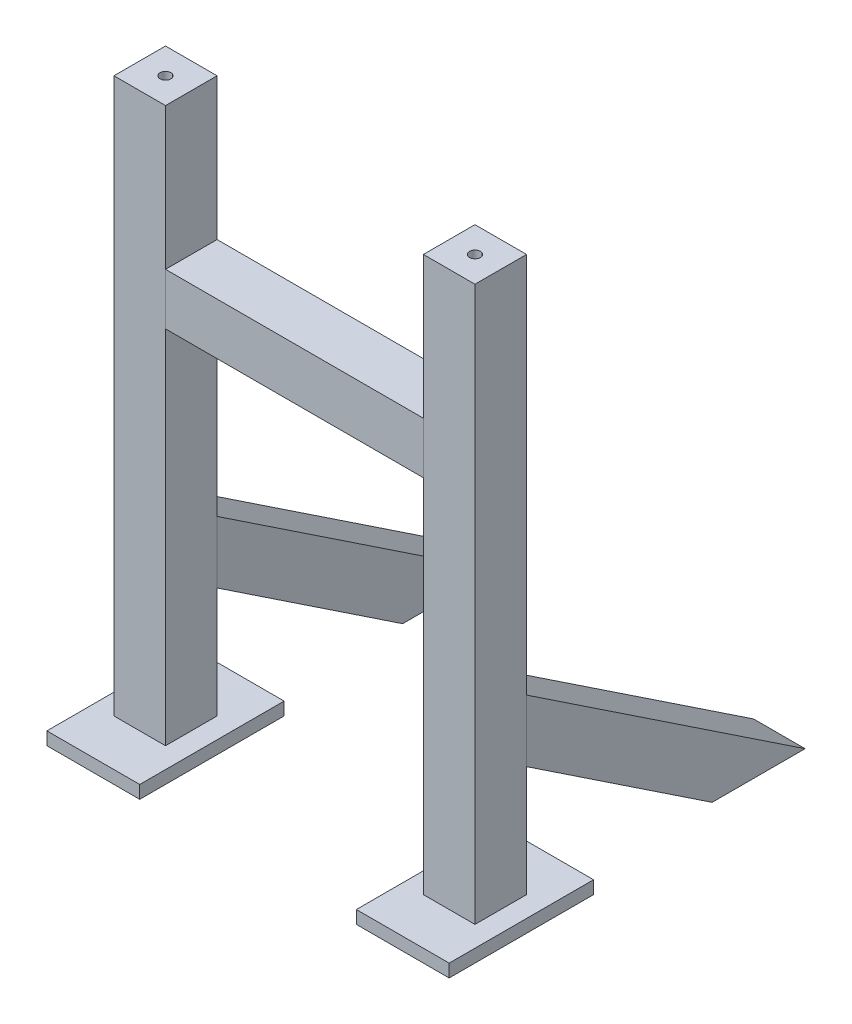
ISO-10303-21;
HEADER;
FILE_DESCRIPTION(('STEP AP214'),'2;1');
FILE_NAME('part.step','',(''),(''),'','','');
FILE_SCHEMA(('AUTOMOTIVE_DESIGN { 1 0 10303 214 1 1 1 1 }'));
ENDSEC;
DATA;
#1=APPLICATION_CONTEXT('core data for automotive mechanical design processes');
#2=APPLICATION_PROTOCOL_DEFINITION('international standard','automotive_design',2000,#1);
#3=PRODUCT_CONTEXT('',#1,'mechanical');
#4=PRODUCT('Part','Part','',(#3));
#5=PRODUCT_RELATED_PRODUCT_CATEGORY('part','',(#4));
#6=PRODUCT_DEFINITION_FORMATION('','',#4);
#7=PRODUCT_DEFINITION_CONTEXT('part definition',#1,'design');
#8=PRODUCT_DEFINITION('design','',#6,#7);
#9=PRODUCT_DEFINITION_SHAPE('','',#8);
#10=(LENGTH_UNIT() NAMED_UNIT(*) SI_UNIT(.MILLI.,.METRE.));
#11=(NAMED_UNIT(*) PLANE_ANGLE_UNIT() SI_UNIT($,.RADIAN.));
#12=(NAMED_UNIT(*) SI_UNIT($,.STERADIAN.) SOLID_ANGLE_UNIT());
#13=UNCERTAINTY_MEASURE_WITH_UNIT(LENGTH_MEASURE(1.E-05),#10,'distance_accuracy_value','');
#14=(GEOMETRIC_REPRESENTATION_CONTEXT(3) GLOBAL_UNCERTAINTY_ASSIGNED_CONTEXT((#13)) GLOBAL_UNIT_ASSIGNED_CONTEXT((#10,
#11,#12)) REPRESENTATION_CONTEXT('',''));
#15=CARTESIAN_POINT('',(0.,0.,0.));
#16=DIRECTION('',(0.,0.,1.));
#17=DIRECTION('',(1.,0.,0.));
#18=AXIS2_PLACEMENT_3D('',#15,#16,#17);
#19=CARTESIAN_POINT('',(-50.,72.0185042515466,-9.99999999999999));
#20=DIRECTION('',(0.,-0.832050294337844,0.554700196225229));
#21=DIRECTION('',(0.,-0.554700196225229,-0.832050294337844));
#22=AXIS2_PLACEMENT_3D('',#19,#20,#21);
#23=PLANE('',#22);
#24=DIRECTION('',(0.,0.554700196225229,0.832050294337844));
#25=VECTOR('',#24,1.);
#26=CARTESIAN_POINT('',(-70.,72.0185042515466,-9.99999999999999));
#27=LINE('',#26,#25);
#28=CARTESIAN_POINT('',(-70.,0.,-118.02775637732));
#29=VERTEX_POINT('',#28);
#30=CARTESIAN_POINT('',(-70.,72.0185042515466,-9.99999999999999));
#31=VERTEX_POINT('',#30);
#32=EDGE_CURVE('E114',#29,#31,#27,.T.);
#33=ORIENTED_EDGE('',*,*,#32,.T.);
#34=DIRECTION('',(-1.,0.,0.));
#35=VECTOR('',#34,1.);
#36=CARTESIAN_POINT('',(-50.,72.0185042515466,-9.99999999999999));
#37=LINE('',#36,#35);
#38=CARTESIAN_POINT('',(-50.,72.0185042515466,-9.99999999999999));
#39=VERTEX_POINT('',#38);
#40=EDGE_CURVE('E12',#39,#31,#37,.T.);
#41=ORIENTED_EDGE('',*,*,#40,.F.);
#42=DIRECTION('',(0.,0.554700196225229,0.832050294337844));
#43=VECTOR('',#42,1.);
#44=CARTESIAN_POINT('',(-50.,72.0185042515466,-9.99999999999999));
#45=LINE('',#44,#43);
#46=CARTESIAN_POINT('',(-50.,0.,-118.02775637732));
#47=VERTEX_POINT('',#46);
#48=EDGE_CURVE('E101',#47,#39,#45,.T.);
#49=ORIENTED_EDGE('',*,*,#48,.F.);
#50=DIRECTION('',(-1.,0.,0.));
#51=VECTOR('',#50,1.);
#52=CARTESIAN_POINT('',(-50.,0.,-118.02775637732));
#53=LINE('',#52,#51);
#54=EDGE_CURVE('E111',#47,#29,#53,.T.);
#55=ORIENTED_EDGE('',*,*,#54,.T.);
#56=EDGE_LOOP('',(#33,#41,#49,#55));
#57=FACE_BOUND('',#56,.T.);
#58=ADVANCED_FACE('F55',(#57),#23,.F.);
#59=CARTESIAN_POINT('',(-50.,47.9814957484534,-10.));
#60=DIRECTION('',(0.,0.,-1.));
#61=DIRECTION('',(-1.,0.,0.));
#62=AXIS2_PLACEMENT_3D('',#59,#60,#61);
#63=PLANE('',#62);
#64=DIRECTION('',(0.,-1.,0.));
#65=VECTOR('',#64,1.);
#66=CARTESIAN_POINT('',(-70.,47.9814957484534,-10.));
#67=LINE('',#66,#65);
#68=CARTESIAN_POINT('',(-70.,47.9814957484534,-10.));
#69=VERTEX_POINT('',#68);
#70=EDGE_CURVE('E110',#31,#69,#67,.T.);
#71=ORIENTED_EDGE('',*,*,#70,.T.);
#72=DIRECTION('',(-1.,0.,0.));
#73=VECTOR('',#72,1.);
#74=CARTESIAN_POINT('',(-50.,47.9814957484534,-10.));
#75=LINE('',#74,#73);
#76=CARTESIAN_POINT('',(-50.,47.9814957484534,-10.));
#77=VERTEX_POINT('',#76);
#78=EDGE_CURVE('E58',#77,#69,#75,.T.);
#79=ORIENTED_EDGE('',*,*,#78,.F.);
#80=DIRECTION('',(0.,-1.,0.));
#81=VECTOR('',#80,1.);
#82=CARTESIAN_POINT('',(-50.,47.9814957484534,-10.));
#83=LINE('',#82,#81);
#84=EDGE_CURVE('E96',#39,#77,#83,.T.);
#85=ORIENTED_EDGE('',*,*,#84,.F.);
#86=ORIENTED_EDGE('',*,*,#40,.T.);
#87=EDGE_LOOP('',(#71,#79,#85,#86));
#88=FACE_BOUND('',#87,.T.);
#89=ADVANCED_FACE('F106',(#88),#63,.F.);
#90=CARTESIAN_POINT('',(-50.,0.,-81.9722436226801));
#91=DIRECTION('',(0.,0.832050294337844,-0.554700196225229));
#92=DIRECTION('',(0.,0.554700196225229,0.832050294337844));
#93=AXIS2_PLACEMENT_3D('',#90,#91,#92);
#94=PLANE('',#93);
#95=DIRECTION('',(0.,-0.554700196225229,-0.832050294337844));
#96=VECTOR('',#95,1.);
#97=CARTESIAN_POINT('',(-70.,0.,-81.9722436226801));
#98=LINE('',#97,#96);
#99=CARTESIAN_POINT('',(-70.,0.,-81.9722436226801));
#100=VERTEX_POINT('',#99);
#101=EDGE_CURVE('E83',#69,#100,#98,.T.);
#102=ORIENTED_EDGE('',*,*,#101,.T.);
#103=DIRECTION('',(-1.,0.,0.));
#104=VECTOR('',#103,1.);
#105=CARTESIAN_POINT('',(-50.,0.,-81.9722436226801));
#106=LINE('',#105,#104);
#107=CARTESIAN_POINT('',(-50.,0.,-81.9722436226801));
#108=VERTEX_POINT('',#107);
#109=EDGE_CURVE('E108',#108,#100,#106,.T.);
#110=ORIENTED_EDGE('',*,*,#109,.F.);
#111=DIRECTION('',(0.,-0.554700196225229,-0.832050294337844));
#112=VECTOR('',#111,1.);
#113=CARTESIAN_POINT('',(-50.,0.,-81.9722436226801));
#114=LINE('',#113,#112);
#115=EDGE_CURVE('E103',#77,#108,#114,.T.);
#116=ORIENTED_EDGE('',*,*,#115,.F.);
#117=ORIENTED_EDGE('',*,*,#78,.T.);
#118=EDGE_LOOP('',(#102,#110,#116,#117));
#119=FACE_BOUND('',#118,.T.);
#120=ADVANCED_FACE('F107',(#119),#94,.F.);
#121=CARTESIAN_POINT('',(-50.,0.,-118.02775637732));
#122=DIRECTION('',(0.,1.,0.));
#123=DIRECTION('',(0.,0.,1.));
#124=AXIS2_PLACEMENT_3D('',#121,#122,#123);
#125=PLANE('',#124);
#126=DIRECTION('',(0.,0.,-1.));
#127=VECTOR('',#126,1.);
#128=CARTESIAN_POINT('',(-70.,0.,-118.02775637732));
#129=LINE('',#128,#127);
#130=EDGE_CURVE('E92',#100,#29,#129,.T.);
#131=ORIENTED_EDGE('',*,*,#130,.T.);
#132=ORIENTED_EDGE('',*,*,#54,.F.);
#133=DIRECTION('',(0.,0.,-1.));
#134=VECTOR('',#133,1.);
#135=CARTESIAN_POINT('',(-50.,0.,-118.02775637732));
#136=LINE('',#135,#134);
#137=EDGE_CURVE('E69',#108,#47,#136,.T.);
#138=ORIENTED_EDGE('',*,*,#137,.F.);
#139=ORIENTED_EDGE('',*,*,#109,.T.);
#140=EDGE_LOOP('',(#131,#132,#138,#139));
#141=FACE_BOUND('',#140,.T.);
#142=ADVANCED_FACE('F125',(#141),#125,.F.);
#143=CARTESIAN_POINT('',(-50.,0.,0.));
#144=DIRECTION('',(1.,0.,0.));
#145=DIRECTION('',(0.,0.,-1.));
#146=AXIS2_PLACEMENT_3D('',#143,#144,#145);
#147=PLANE('',#146);
#148=ORIENTED_EDGE('',*,*,#48,.T.);
#149=ORIENTED_EDGE('',*,*,#84,.T.);
#150=ORIENTED_EDGE('',*,*,#115,.T.);
#151=ORIENTED_EDGE('',*,*,#137,.T.);
#152=EDGE_LOOP('',(#148,#149,#150,#151));
#153=FACE_BOUND('',#152,.T.);
#154=ADVANCED_FACE('F100',(#153),#147,.T.);
#155=CARTESIAN_POINT('',(-70.,0.,0.));
#156=DIRECTION('',(1.,0.,0.));
#157=DIRECTION('',(0.,0.,-1.));
#158=AXIS2_PLACEMENT_3D('',#155,#156,#157);
#159=PLANE('',#158);
#160=ORIENTED_EDGE('',*,*,#32,.F.);
#161=ORIENTED_EDGE('',*,*,#130,.F.);
#162=ORIENTED_EDGE('',*,*,#101,.F.);
#163=ORIENTED_EDGE('',*,*,#70,.F.);
#164=EDGE_LOOP('',(#160,#161,#162,#163));
#165=FACE_BOUND('',#164,.T.);
#166=ADVANCED_FACE('F123',(#165),#159,.F.);
#167=CLOSED_SHELL('',(#58,#89,#120,#142,#154,#166));
#168=MANIFOLD_SOLID_BREP('B2',#167);
#169=CARTESIAN_POINT('',(70.,72.0185042515466,-9.99999999999999));
#170=DIRECTION('',(0.,-0.832050294337844,0.554700196225229));
#171=DIRECTION('',(0.,-0.554700196225229,-0.832050294337844));
#172=AXIS2_PLACEMENT_3D('',#169,#170,#171);
#173=PLANE('',#172);
#174=DIRECTION('',(0.,0.554700196225229,0.832050294337844));
#175=VECTOR('',#174,1.);
#176=CARTESIAN_POINT('',(50.,72.0185042515466,-9.99999999999999));
#177=LINE('',#176,#175);
#178=CARTESIAN_POINT('',(50.,0.,-118.02775637732));
#179=VERTEX_POINT('',#178);
#180=CARTESIAN_POINT('',(50.,72.0185042515466,-9.99999999999999));
#181=VERTEX_POINT('',#180);
#182=EDGE_CURVE('E240',#179,#181,#177,.T.);
#183=ORIENTED_EDGE('',*,*,#182,.T.);
#184=DIRECTION('',(-1.,0.,0.));
#185=VECTOR('',#184,1.);
#186=CARTESIAN_POINT('',(70.,72.0185042515466,-9.99999999999999));
#187=LINE('',#186,#185);
#188=CARTESIAN_POINT('',(70.,72.0185042515466,-9.99999999999999));
#189=VERTEX_POINT('',#188);
#190=EDGE_CURVE('E49',#189,#181,#187,.T.);
#191=ORIENTED_EDGE('',*,*,#190,.F.);
#192=DIRECTION('',(0.,0.554700196225229,0.832050294337844));
#193=VECTOR('',#192,1.);
#194=CARTESIAN_POINT('',(70.,72.0185042515466,-9.99999999999999));
#195=LINE('',#194,#193);
#196=CARTESIAN_POINT('',(70.,0.,-118.02775637732));
#197=VERTEX_POINT('',#196);
#198=EDGE_CURVE('E223',#197,#189,#195,.T.);
#199=ORIENTED_EDGE('',*,*,#198,.F.);
#200=DIRECTION('',(-1.,0.,0.));
#201=VECTOR('',#200,1.);
#202=CARTESIAN_POINT('',(70.,0.,-118.02775637732));
#203=LINE('',#202,#201);
#204=EDGE_CURVE('E231',#197,#179,#203,.T.);
#205=ORIENTED_EDGE('',*,*,#204,.T.);
#206=EDGE_LOOP('',(#183,#191,#199,#205));
#207=FACE_BOUND('',#206,.T.);
#208=ADVANCED_FACE('F172',(#207),#173,.F.);
#209=CARTESIAN_POINT('',(70.,47.9814957484534,-10.));
#210=DIRECTION('',(0.,0.,-1.));
#211=DIRECTION('',(-1.,0.,0.));
#212=AXIS2_PLACEMENT_3D('',#209,#210,#211);
#213=PLANE('',#212);
#214=DIRECTION('',(0.,-1.,0.));
#215=VECTOR('',#214,1.);
#216=CARTESIAN_POINT('',(50.,47.9814957484534,-10.));
#217=LINE('',#216,#215);
#218=CARTESIAN_POINT('',(50.,47.9814957484534,-10.));
#219=VERTEX_POINT('',#218);
#220=EDGE_CURVE('E230',#181,#219,#217,.T.);
#221=ORIENTED_EDGE('',*,*,#220,.T.);
#222=DIRECTION('',(-1.,0.,0.));
#223=VECTOR('',#222,1.);
#224=CARTESIAN_POINT('',(70.,47.9814957484534,-10.));
#225=LINE('',#224,#223);
#226=CARTESIAN_POINT('',(70.,47.9814957484534,-10.));
#227=VERTEX_POINT('',#226);
#228=EDGE_CURVE('E185',#227,#219,#225,.T.);
#229=ORIENTED_EDGE('',*,*,#228,.F.);
#230=DIRECTION('',(0.,-1.,0.));
#231=VECTOR('',#230,1.);
#232=CARTESIAN_POINT('',(70.,47.9814957484534,-10.));
#233=LINE('',#232,#231);
#234=EDGE_CURVE('E220',#189,#227,#233,.T.);
#235=ORIENTED_EDGE('',*,*,#234,.F.);
#236=ORIENTED_EDGE('',*,*,#190,.T.);
#237=EDGE_LOOP('',(#221,#229,#235,#236));
#238=FACE_BOUND('',#237,.T.);
#239=ADVANCED_FACE('F226',(#238),#213,.F.);
#240=CARTESIAN_POINT('',(70.,0.,-81.9722436226801));
#241=DIRECTION('',(0.,0.832050294337844,-0.554700196225229));
#242=DIRECTION('',(0.,0.554700196225229,0.832050294337844));
#243=AXIS2_PLACEMENT_3D('',#240,#241,#242);
#244=PLANE('',#243);
#245=DIRECTION('',(0.,-0.554700196225229,-0.832050294337844));
#246=VECTOR('',#245,1.);
#247=CARTESIAN_POINT('',(50.,0.,-81.9722436226801));
#248=LINE('',#247,#246);
#249=CARTESIAN_POINT('',(50.,0.,-81.9722436226801));
#250=VERTEX_POINT('',#249);
#251=EDGE_CURVE('E210',#219,#250,#248,.T.);
#252=ORIENTED_EDGE('',*,*,#251,.T.);
#253=DIRECTION('',(-1.,0.,0.));
#254=VECTOR('',#253,1.);
#255=CARTESIAN_POINT('',(70.,0.,-81.9722436226801));
#256=LINE('',#255,#254);
#257=CARTESIAN_POINT('',(70.,0.,-81.9722436226801));
#258=VERTEX_POINT('',#257);
#259=EDGE_CURVE('E229',#258,#250,#256,.T.);
#260=ORIENTED_EDGE('',*,*,#259,.F.);
#261=DIRECTION('',(0.,-0.554700196225229,-0.832050294337844));
#262=VECTOR('',#261,1.);
#263=CARTESIAN_POINT('',(70.,0.,-81.9722436226801));
#264=LINE('',#263,#262);
#265=EDGE_CURVE('E224',#227,#258,#264,.T.);
#266=ORIENTED_EDGE('',*,*,#265,.F.);
#267=ORIENTED_EDGE('',*,*,#228,.T.);
#268=EDGE_LOOP('',(#252,#260,#266,#267));
#269=FACE_BOUND('',#268,.T.);
#270=ADVANCED_FACE('F233',(#269),#244,.F.);
#271=CARTESIAN_POINT('',(70.,0.,-118.02775637732));
#272=DIRECTION('',(0.,1.,0.));
#273=DIRECTION('',(0.,0.,1.));
#274=AXIS2_PLACEMENT_3D('',#271,#272,#273);
#275=PLANE('',#274);
#276=DIRECTION('',(0.,0.,-1.));
#277=VECTOR('',#276,1.);
#278=CARTESIAN_POINT('',(50.,0.,-118.02775637732));
#279=LINE('',#278,#277);
#280=EDGE_CURVE('E214',#250,#179,#279,.T.);
#281=ORIENTED_EDGE('',*,*,#280,.T.);
#282=ORIENTED_EDGE('',*,*,#204,.F.);
#283=DIRECTION('',(0.,0.,-1.));
#284=VECTOR('',#283,1.);
#285=CARTESIAN_POINT('',(70.,0.,-118.02775637732));
#286=LINE('',#285,#284);
#287=EDGE_CURVE('E188',#258,#197,#286,.T.);
#288=ORIENTED_EDGE('',*,*,#287,.F.);
#289=ORIENTED_EDGE('',*,*,#259,.T.);
#290=EDGE_LOOP('',(#281,#282,#288,#289));
#291=FACE_BOUND('',#290,.T.);
#292=ADVANCED_FACE('F242',(#291),#275,.F.);
#293=CARTESIAN_POINT('',(70.,0.,0.));
#294=DIRECTION('',(1.,0.,0.));
#295=DIRECTION('',(0.,0.,-1.));
#296=AXIS2_PLACEMENT_3D('',#293,#294,#295);
#297=PLANE('',#296);
#298=ORIENTED_EDGE('',*,*,#198,.T.);
#299=ORIENTED_EDGE('',*,*,#234,.T.);
#300=ORIENTED_EDGE('',*,*,#265,.T.);
#301=ORIENTED_EDGE('',*,*,#287,.T.);
#302=EDGE_LOOP('',(#298,#299,#300,#301));
#303=FACE_BOUND('',#302,.T.);
#304=ADVANCED_FACE('F222',(#303),#297,.T.);
#305=CARTESIAN_POINT('',(50.,0.,0.));
#306=DIRECTION('',(1.,0.,0.));
#307=DIRECTION('',(0.,0.,-1.));
#308=AXIS2_PLACEMENT_3D('',#305,#306,#307);
#309=PLANE('',#308);
#310=ORIENTED_EDGE('',*,*,#182,.F.);
#311=ORIENTED_EDGE('',*,*,#280,.F.);
#312=ORIENTED_EDGE('',*,*,#251,.F.);
#313=ORIENTED_EDGE('',*,*,#220,.F.);
#314=EDGE_LOOP('',(#310,#311,#312,#313));
#315=FACE_BOUND('',#314,.T.);
#316=ADVANCED_FACE('F250',(#315),#309,.F.);
#317=CLOSED_SHELL('',(#208,#239,#270,#292,#304,#316));
#318=MANIFOLD_SOLID_BREP('B6',#317);
#319=CARTESIAN_POINT('',(50.,0.,0.));
#320=DIRECTION('',(1.,0.,0.));
#321=DIRECTION('',(0.,0.,-1.));
#322=AXIS2_PLACEMENT_3D('',#319,#320,#321);
#323=PLANE('',#322);
#324=DIRECTION('',(0.,1.,0.));
#325=VECTOR('',#324,1.);
#326=CARTESIAN_POINT('',(50.,145.,-10.));
#327=LINE('',#326,#325);
#328=CARTESIAN_POINT('',(50.,145.,-10.));
#329=VERTEX_POINT('',#328);
#330=CARTESIAN_POINT('',(50.,165.,-10.));
#331=VERTEX_POINT('',#330);
#332=EDGE_CURVE('E349',#329,#331,#327,.T.);
#333=ORIENTED_EDGE('',*,*,#332,.T.);
#334=DIRECTION('',(0.,0.,1.));
#335=VECTOR('',#334,1.);
#336=CARTESIAN_POINT('',(50.,165.,-10.));
#337=LINE('',#336,#335);
#338=CARTESIAN_POINT('',(50.,165.,10.));
#339=VERTEX_POINT('',#338);
#340=EDGE_CURVE('E344',#331,#339,#337,.T.);
#341=ORIENTED_EDGE('',*,*,#340,.T.);
#342=DIRECTION('',(0.,-1.,0.));
#343=VECTOR('',#342,1.);
#344=CARTESIAN_POINT('',(50.,145.,10.));
#345=LINE('',#344,#343);
#346=CARTESIAN_POINT('',(50.,145.,10.));
#347=VERTEX_POINT('',#346);
#348=EDGE_CURVE('E346',#339,#347,#345,.T.);
#349=ORIENTED_EDGE('',*,*,#348,.T.);
#350=DIRECTION('',(0.,0.,-1.));
#351=VECTOR('',#350,1.);
#352=CARTESIAN_POINT('',(50.,145.,-10.));
#353=LINE('',#352,#351);
#354=EDGE_CURVE('E312',#347,#329,#353,.T.);
#355=ORIENTED_EDGE('',*,*,#354,.T.);
#356=EDGE_LOOP('',(#333,#341,#349,#355));
#357=FACE_BOUND('',#356,.T.);
#358=CARTESIAN_POINT('',(50.,155.,0.));
#359=DIRECTION('',(1.,0.,0.));
#360=DIRECTION('',(0.,0.,-1.));
#361=AXIS2_PLACEMENT_3D('',#358,#359,#360);
#362=CIRCLE('',#361,2.1);
#363=CARTESIAN_POINT('',(50.,155.,-2.1));
#364=VERTEX_POINT('',#363);
#365=EDGE_CURVE('E361',#364,#364,#362,.T.);
#366=ORIENTED_EDGE('',*,*,#365,.F.);
#367=EDGE_LOOP('',(#366));
#368=FACE_BOUND('',#367,.T.);
#369=ADVANCED_FACE('F298',(#357,#368),#323,.T.);
#370=CARTESIAN_POINT('',(-50.,0.,0.));
#371=DIRECTION('',(1.,0.,0.));
#372=DIRECTION('',(0.,0.,-1.));
#373=AXIS2_PLACEMENT_3D('',#370,#371,#372);
#374=PLANE('',#373);
#375=DIRECTION('',(0.,1.,0.));
#376=VECTOR('',#375,1.);
#377=CARTESIAN_POINT('',(-50.,145.,-10.));
#378=LINE('',#377,#376);
#379=CARTESIAN_POINT('',(-50.,145.,-10.));
#380=VERTEX_POINT('',#379);
#381=CARTESIAN_POINT('',(-50.,165.,-10.));
#382=VERTEX_POINT('',#381);
#383=EDGE_CURVE('E359',#380,#382,#378,.T.);
#384=ORIENTED_EDGE('',*,*,#383,.F.);
#385=DIRECTION('',(0.,0.,-1.));
#386=VECTOR('',#385,1.);
#387=CARTESIAN_POINT('',(-50.,145.,-10.));
#388=LINE('',#387,#386);
#389=CARTESIAN_POINT('',(-50.,145.,10.));
#390=VERTEX_POINT('',#389);
#391=EDGE_CURVE('E337',#390,#380,#388,.T.);
#392=ORIENTED_EDGE('',*,*,#391,.F.);
#393=DIRECTION('',(0.,-1.,0.));
#394=VECTOR('',#393,1.);
#395=CARTESIAN_POINT('',(-50.,145.,10.));
#396=LINE('',#395,#394);
#397=CARTESIAN_POINT('',(-50.,165.,10.));
#398=VERTEX_POINT('',#397);
#399=EDGE_CURVE('E330',#398,#390,#396,.T.);
#400=ORIENTED_EDGE('',*,*,#399,.F.);
#401=DIRECTION('',(0.,0.,1.));
#402=VECTOR('',#401,1.);
#403=CARTESIAN_POINT('',(-50.,165.,-10.));
#404=LINE('',#403,#402);
#405=EDGE_CURVE('E355',#382,#398,#404,.T.);
#406=ORIENTED_EDGE('',*,*,#405,.F.);
#407=EDGE_LOOP('',(#384,#392,#400,#406));
#408=FACE_BOUND('',#407,.T.);
#409=CARTESIAN_POINT('',(-50.,155.,0.));
#410=DIRECTION('',(1.,0.,0.));
#411=DIRECTION('',(0.,0.,-1.));
#412=AXIS2_PLACEMENT_3D('',#409,#410,#411);
#413=CIRCLE('',#412,2.1);
#414=CARTESIAN_POINT('',(-50.,155.,-2.1));
#415=VERTEX_POINT('',#414);
#416=EDGE_CURVE('E374',#415,#415,#413,.T.);
#417=ORIENTED_EDGE('',*,*,#416,.T.);
#418=EDGE_LOOP('',(#417));
#419=FACE_BOUND('',#418,.T.);
#420=ADVANCED_FACE('F371',(#408,#419),#374,.F.);
#421=CARTESIAN_POINT('',(50.,145.,-10.));
#422=DIRECTION('',(0.,0.,1.));
#423=DIRECTION('',(1.,0.,0.));
#424=AXIS2_PLACEMENT_3D('',#421,#422,#423);
#425=PLANE('',#424);
#426=ORIENTED_EDGE('',*,*,#383,.T.);
#427=DIRECTION('',(-1.,0.,0.));
#428=VECTOR('',#427,1.);
#429=CARTESIAN_POINT('',(50.,165.,-10.));
#430=LINE('',#429,#428);
#431=EDGE_CURVE('E175',#331,#382,#430,.T.);
#432=ORIENTED_EDGE('',*,*,#431,.F.);
#433=ORIENTED_EDGE('',*,*,#332,.F.);
#434=DIRECTION('',(-1.,0.,0.));
#435=VECTOR('',#434,1.);
#436=CARTESIAN_POINT('',(50.,145.,-10.));
#437=LINE('',#436,#435);
#438=EDGE_CURVE('E358',#329,#380,#437,.T.);
#439=ORIENTED_EDGE('',*,*,#438,.T.);
#440=EDGE_LOOP('',(#426,#432,#433,#439));
#441=FACE_BOUND('',#440,.T.);
#442=ADVANCED_FACE('F296',(#441),#425,.F.);
#443=CARTESIAN_POINT('',(50.,165.,-10.));
#444=DIRECTION('',(0.,-1.,0.));
#445=DIRECTION('',(0.,0.,-1.));
#446=AXIS2_PLACEMENT_3D('',#443,#444,#445);
#447=PLANE('',#446);
#448=ORIENTED_EDGE('',*,*,#405,.T.);
#449=DIRECTION('',(-1.,0.,0.));
#450=VECTOR('',#449,1.);
#451=CARTESIAN_POINT('',(50.,165.,10.));
#452=LINE('',#451,#450);
#453=EDGE_CURVE('E304',#339,#398,#452,.T.);
#454=ORIENTED_EDGE('',*,*,#453,.F.);
#455=ORIENTED_EDGE('',*,*,#340,.F.);
#456=ORIENTED_EDGE('',*,*,#431,.T.);
#457=EDGE_LOOP('',(#448,#454,#455,#456));
#458=FACE_BOUND('',#457,.T.);
#459=ADVANCED_FACE('F352',(#458),#447,.F.);
#460=CARTESIAN_POINT('',(50.,145.,10.));
#461=DIRECTION('',(0.,0.,-1.));
#462=DIRECTION('',(-1.,0.,0.));
#463=AXIS2_PLACEMENT_3D('',#460,#461,#462);
#464=PLANE('',#463);
#465=ORIENTED_EDGE('',*,*,#399,.T.);
#466=DIRECTION('',(-1.,0.,0.));
#467=VECTOR('',#466,1.);
#468=CARTESIAN_POINT('',(50.,145.,10.));
#469=LINE('',#468,#467);
#470=EDGE_CURVE('E354',#347,#390,#469,.T.);
#471=ORIENTED_EDGE('',*,*,#470,.F.);
#472=ORIENTED_EDGE('',*,*,#348,.F.);
#473=ORIENTED_EDGE('',*,*,#453,.T.);
#474=EDGE_LOOP('',(#465,#471,#472,#473));
#475=FACE_BOUND('',#474,.T.);
#476=ADVANCED_FACE('F351',(#475),#464,.F.);
#477=CARTESIAN_POINT('',(50.,145.,-10.));
#478=DIRECTION('',(0.,1.,0.));
#479=DIRECTION('',(0.,0.,1.));
#480=AXIS2_PLACEMENT_3D('',#477,#478,#479);
#481=PLANE('',#480);
#482=ORIENTED_EDGE('',*,*,#391,.T.);
#483=ORIENTED_EDGE('',*,*,#438,.F.);
#484=ORIENTED_EDGE('',*,*,#354,.F.);
#485=ORIENTED_EDGE('',*,*,#470,.T.);
#486=EDGE_LOOP('',(#482,#483,#484,#485));
#487=FACE_BOUND('',#486,.T.);
#488=ADVANCED_FACE('F368',(#487),#481,.F.);
#489=CARTESIAN_POINT('',(50.,155.,0.));
#490=DIRECTION('',(-1.,0.,0.));
#491=DIRECTION('',(0.,0.,1.));
#492=AXIS2_PLACEMENT_3D('',#489,#490,#491);
#493=CYLINDRICAL_SURFACE('',#492,2.1);
#494=ORIENTED_EDGE('',*,*,#365,.T.);
#495=EDGE_LOOP('',(#494));
#496=FACE_BOUND('',#495,.T.);
#497=ORIENTED_EDGE('',*,*,#416,.F.);
#498=EDGE_LOOP('',(#497));
#499=FACE_BOUND('',#498,.T.);
#500=ADVANCED_FACE('F382',(#496,#499),#493,.F.);
#501=CLOSED_SHELL('',(#369,#420,#442,#459,#476,#488,#500));
#502=MANIFOLD_SOLID_BREP('B42',#501);
#503=CARTESIAN_POINT('',(0.,220.,0.));
#504=DIRECTION('',(0.,-1.,0.));
#505=DIRECTION('',(0.,0.,-1.));
#506=AXIS2_PLACEMENT_3D('',#503,#504,#505);
#507=PLANE('',#506);
#508=DIRECTION('',(0.,0.,-1.));
#509=VECTOR('',#508,1.);
#510=CARTESIAN_POINT('',(-50.,220.,-10.));
#511=LINE('',#510,#509);
#512=CARTESIAN_POINT('',(-50.,220.,10.));
#513=VERTEX_POINT('',#512);
#514=CARTESIAN_POINT('',(-50.,220.,-10.));
#515=VERTEX_POINT('',#514);
#516=EDGE_CURVE('E501',#513,#515,#511,.T.);
#517=ORIENTED_EDGE('',*,*,#516,.T.);
#518=DIRECTION('',(-1.,0.,0.));
#519=VECTOR('',#518,1.);
#520=CARTESIAN_POINT('',(-50.,220.,-10.));
#521=LINE('',#520,#519);
#522=CARTESIAN_POINT('',(-70.,220.,-10.));
#523=VERTEX_POINT('',#522);
#524=EDGE_CURVE('E468',#515,#523,#521,.T.);
#525=ORIENTED_EDGE('',*,*,#524,.T.);
#526=DIRECTION('',(0.,0.,1.));
#527=VECTOR('',#526,1.);
#528=CARTESIAN_POINT('',(-70.,220.,-10.));
#529=LINE('',#528,#527);
#530=CARTESIAN_POINT('',(-70.,220.,10.));
#531=VERTEX_POINT('',#530);
#532=EDGE_CURVE('E508',#523,#531,#529,.T.);
#533=ORIENTED_EDGE('',*,*,#532,.T.);
#534=DIRECTION('',(1.,0.,0.));
#535=VECTOR('',#534,1.);
#536=CARTESIAN_POINT('',(-50.,220.,10.));
#537=LINE('',#536,#535);
#538=EDGE_CURVE('E494',#531,#513,#537,.T.);
#539=ORIENTED_EDGE('',*,*,#538,.T.);
#540=EDGE_LOOP('',(#517,#525,#533,#539));
#541=FACE_BOUND('',#540,.T.);
#542=CARTESIAN_POINT('',(-60.,220.,0.));
#543=DIRECTION('',(0.,1.,0.));
#544=DIRECTION('',(0.,0.,1.));
#545=AXIS2_PLACEMENT_3D('',#542,#543,#544);
#546=CIRCLE('',#545,2.1);
#547=CARTESIAN_POINT('',(-60.,220.,2.1));
#548=VERTEX_POINT('',#547);
#549=EDGE_CURVE('E441',#548,#548,#546,.T.);
#550=ORIENTED_EDGE('',*,*,#549,.F.);
#551=EDGE_LOOP('',(#550));
#552=FACE_BOUND('',#551,.T.);
#553=ADVANCED_FACE('F440',(#541,#552),#507,.F.);
#554=CARTESIAN_POINT('',(0.,5.,0.));
#555=DIRECTION('',(0.,-1.,0.));
#556=DIRECTION('',(0.,0.,-1.));
#557=AXIS2_PLACEMENT_3D('',#554,#555,#556);
#558=PLANE('',#557);
#559=DIRECTION('',(0.,0.,-1.));
#560=VECTOR('',#559,1.);
#561=CARTESIAN_POINT('',(-50.,5.,-10.));
#562=LINE('',#561,#560);
#563=CARTESIAN_POINT('',(-50.,5.,10.));
#564=VERTEX_POINT('',#563);
#565=CARTESIAN_POINT('',(-50.,5.,-10.));
#566=VERTEX_POINT('',#565);
#567=EDGE_CURVE('E499',#564,#566,#562,.T.);
#568=ORIENTED_EDGE('',*,*,#567,.F.);
#569=DIRECTION('',(1.,0.,0.));
#570=VECTOR('',#569,1.);
#571=CARTESIAN_POINT('',(-50.,5.,10.));
#572=LINE('',#571,#570);
#573=CARTESIAN_POINT('',(-70.,5.,10.));
#574=VERTEX_POINT('',#573);
#575=EDGE_CURVE('E480',#574,#564,#572,.T.);
#576=ORIENTED_EDGE('',*,*,#575,.F.);
#577=DIRECTION('',(0.,0.,1.));
#578=VECTOR('',#577,1.);
#579=CARTESIAN_POINT('',(-70.,5.,-10.));
#580=LINE('',#579,#578);
#581=CARTESIAN_POINT('',(-70.,5.,-10.));
#582=VERTEX_POINT('',#581);
#583=EDGE_CURVE('E488',#582,#574,#580,.T.);
#584=ORIENTED_EDGE('',*,*,#583,.F.);
#585=DIRECTION('',(-1.,0.,0.));
#586=VECTOR('',#585,1.);
#587=CARTESIAN_POINT('',(-50.,5.,-10.));
#588=LINE('',#587,#586);
#589=EDGE_CURVE('E451',#566,#582,#588,.T.);
#590=ORIENTED_EDGE('',*,*,#589,.F.);
#591=EDGE_LOOP('',(#568,#576,#584,#590));
#592=FACE_BOUND('',#591,.T.);
#593=CARTESIAN_POINT('',(-60.,5.,0.));
#594=DIRECTION('',(0.,1.,0.));
#595=DIRECTION('',(0.,0.,1.));
#596=AXIS2_PLACEMENT_3D('',#593,#594,#595);
#597=CIRCLE('',#596,2.1);
#598=CARTESIAN_POINT('',(-60.,5.,2.1));
#599=VERTEX_POINT('',#598);
#600=EDGE_CURVE('E295',#599,#599,#597,.T.);
#601=ORIENTED_EDGE('',*,*,#600,.T.);
#602=EDGE_LOOP('',(#601));
#603=FACE_BOUND('',#602,.T.);
#604=ADVANCED_FACE('F500',(#592,#603),#558,.T.);
#605=CARTESIAN_POINT('',(-50.,220.,-10.));
#606=DIRECTION('',(-1.,0.,0.));
#607=DIRECTION('',(0.,0.,1.));
#608=AXIS2_PLACEMENT_3D('',#605,#606,#607);
#609=PLANE('',#608);
#610=ORIENTED_EDGE('',*,*,#567,.T.);
#611=DIRECTION('',(0.,-1.,0.));
#612=VECTOR('',#611,1.);
#613=CARTESIAN_POINT('',(-50.,220.,-10.));
#614=LINE('',#613,#612);
#615=EDGE_CURVE('E517',#515,#566,#614,.T.);
#616=ORIENTED_EDGE('',*,*,#615,.F.);
#617=ORIENTED_EDGE('',*,*,#516,.F.);
#618=DIRECTION('',(0.,-1.,0.));
#619=VECTOR('',#618,1.);
#620=CARTESIAN_POINT('',(-50.,220.,10.));
#621=LINE('',#620,#619);
#622=EDGE_CURVE('E492',#513,#564,#621,.T.);
#623=ORIENTED_EDGE('',*,*,#622,.T.);
#624=EDGE_LOOP('',(#610,#616,#617,#623));
#625=FACE_BOUND('',#624,.T.);
#626=ADVANCED_FACE('F513',(#625),#609,.F.);
#627=CARTESIAN_POINT('',(-50.,220.,-10.));
#628=DIRECTION('',(0.,0.,1.));
#629=DIRECTION('',(1.,0.,0.));
#630=AXIS2_PLACEMENT_3D('',#627,#628,#629);
#631=PLANE('',#630);
#632=ORIENTED_EDGE('',*,*,#589,.T.);
#633=DIRECTION('',(0.,-1.,0.));
#634=VECTOR('',#633,1.);
#635=CARTESIAN_POINT('',(-70.,220.,-10.));
#636=LINE('',#635,#634);
#637=EDGE_CURVE('E493',#523,#582,#636,.T.);
#638=ORIENTED_EDGE('',*,*,#637,.F.);
#639=ORIENTED_EDGE('',*,*,#524,.F.);
#640=ORIENTED_EDGE('',*,*,#615,.T.);
#641=EDGE_LOOP('',(#632,#638,#639,#640));
#642=FACE_BOUND('',#641,.T.);
#643=ADVANCED_FACE('F516',(#642),#631,.F.);
#644=CARTESIAN_POINT('',(-70.,220.,-10.));
#645=DIRECTION('',(1.,0.,0.));
#646=DIRECTION('',(0.,0.,-1.));
#647=AXIS2_PLACEMENT_3D('',#644,#645,#646);
#648=PLANE('',#647);
#649=ORIENTED_EDGE('',*,*,#583,.T.);
#650=DIRECTION('',(0.,-1.,0.));
#651=VECTOR('',#650,1.);
#652=CARTESIAN_POINT('',(-70.,220.,10.));
#653=LINE('',#652,#651);
#654=EDGE_CURVE('E490',#531,#574,#653,.T.);
#655=ORIENTED_EDGE('',*,*,#654,.F.);
#656=ORIENTED_EDGE('',*,*,#532,.F.);
#657=ORIENTED_EDGE('',*,*,#637,.T.);
#658=EDGE_LOOP('',(#649,#655,#656,#657));
#659=FACE_BOUND('',#658,.T.);
#660=ADVANCED_FACE('F487',(#659),#648,.F.);
#661=CARTESIAN_POINT('',(-50.,220.,10.));
#662=DIRECTION('',(0.,0.,-1.));
#663=DIRECTION('',(-1.,0.,0.));
#664=AXIS2_PLACEMENT_3D('',#661,#662,#663);
#665=PLANE('',#664);
#666=ORIENTED_EDGE('',*,*,#575,.T.);
#667=ORIENTED_EDGE('',*,*,#622,.F.);
#668=ORIENTED_EDGE('',*,*,#538,.F.);
#669=ORIENTED_EDGE('',*,*,#654,.T.);
#670=EDGE_LOOP('',(#666,#667,#668,#669));
#671=FACE_BOUND('',#670,.T.);
#672=ADVANCED_FACE('F491',(#671),#665,.F.);
#673=CARTESIAN_POINT('',(-60.,220.,0.));
#674=DIRECTION('',(0.,-1.,0.));
#675=DIRECTION('',(0.,0.,-1.));
#676=AXIS2_PLACEMENT_3D('',#673,#674,#675);
#677=CYLINDRICAL_SURFACE('',#676,2.1);
#678=ORIENTED_EDGE('',*,*,#549,.T.);
#679=EDGE_LOOP('',(#678));
#680=FACE_BOUND('',#679,.T.);
#681=ORIENTED_EDGE('',*,*,#600,.F.);
#682=EDGE_LOOP('',(#681));
#683=FACE_BOUND('',#682,.T.);
#684=ADVANCED_FACE('F437',(#680,#683),#677,.F.);
#685=CLOSED_SHELL('',(#553,#604,#626,#643,#660,#672,#684));
#686=MANIFOLD_SOLID_BREP('B168',#685);
#687=CARTESIAN_POINT('',(0.,220.,0.));
#688=DIRECTION('',(0.,1.,0.));
#689=DIRECTION('',(0.,0.,1.));
#690=AXIS2_PLACEMENT_3D('',#687,#688,#689);
#691=PLANE('',#690);
#692=DIRECTION('',(0.,0.,1.));
#693=VECTOR('',#692,1.);
#694=CARTESIAN_POINT('',(50.,220.,-10.));
#695=LINE('',#694,#693);
#696=CARTESIAN_POINT('',(50.,220.,-10.));
#697=VERTEX_POINT('',#696);
#698=CARTESIAN_POINT('',(50.,220.,10.));
#699=VERTEX_POINT('',#698);
#700=EDGE_CURVE('E629',#697,#699,#695,.T.);
#701=ORIENTED_EDGE('',*,*,#700,.T.);
#702=DIRECTION('',(1.,0.,0.));
#703=VECTOR('',#702,1.);
#704=CARTESIAN_POINT('',(50.,220.,10.));
#705=LINE('',#704,#703);
#706=CARTESIAN_POINT('',(70.,220.,10.));
#707=VERTEX_POINT('',#706);
#708=EDGE_CURVE('E622',#699,#707,#705,.T.);
#709=ORIENTED_EDGE('',*,*,#708,.T.);
#710=DIRECTION('',(0.,0.,-1.));
#711=VECTOR('',#710,1.);
#712=CARTESIAN_POINT('',(70.,220.,-10.));
#713=LINE('',#712,#711);
#714=CARTESIAN_POINT('',(70.,220.,-10.));
#715=VERTEX_POINT('',#714);
#716=EDGE_CURVE('E628',#707,#715,#713,.T.);
#717=ORIENTED_EDGE('',*,*,#716,.T.);
#718=DIRECTION('',(-1.,0.,0.));
#719=VECTOR('',#718,1.);
#720=CARTESIAN_POINT('',(50.,220.,-10.));
#721=LINE('',#720,#719);
#722=EDGE_CURVE('E593',#715,#697,#721,.T.);
#723=ORIENTED_EDGE('',*,*,#722,.T.);
#724=EDGE_LOOP('',(#701,#709,#717,#723));
#725=FACE_BOUND('',#724,.T.);
#726=CARTESIAN_POINT('',(60.,220.,0.));
#727=DIRECTION('',(0.,1.,0.));
#728=DIRECTION('',(0.,0.,1.));
#729=AXIS2_PLACEMENT_3D('',#726,#727,#728);
#730=CIRCLE('',#729,2.1);
#731=CARTESIAN_POINT('',(60.,220.,2.1));
#732=VERTEX_POINT('',#731);
#733=EDGE_CURVE('E643',#732,#732,#730,.T.);
#734=ORIENTED_EDGE('',*,*,#733,.F.);
#735=EDGE_LOOP('',(#734));
#736=FACE_BOUND('',#735,.T.);
#737=ADVANCED_FACE('F579',(#725,#736),#691,.T.);
#738=CARTESIAN_POINT('',(0.,5.,0.));
#739=DIRECTION('',(0.,1.,0.));
#740=DIRECTION('',(0.,0.,1.));
#741=AXIS2_PLACEMENT_3D('',#738,#739,#740);
#742=PLANE('',#741);
#743=DIRECTION('',(0.,0.,1.));
#744=VECTOR('',#743,1.);
#745=CARTESIAN_POINT('',(50.,5.,-10.));
#746=LINE('',#745,#744);
#747=CARTESIAN_POINT('',(50.,5.,-10.));
#748=VERTEX_POINT('',#747);
#749=CARTESIAN_POINT('',(50.,5.,10.));
#750=VERTEX_POINT('',#749);
#751=EDGE_CURVE('E645',#748,#750,#746,.T.);
#752=ORIENTED_EDGE('',*,*,#751,.F.);
#753=DIRECTION('',(-1.,0.,0.));
#754=VECTOR('',#753,1.);
#755=CARTESIAN_POINT('',(50.,5.,-10.));
#756=LINE('',#755,#754);
#757=CARTESIAN_POINT('',(70.,5.,-10.));
#758=VERTEX_POINT('',#757);
#759=EDGE_CURVE('E616',#758,#748,#756,.T.);
#760=ORIENTED_EDGE('',*,*,#759,.F.);
#761=DIRECTION('',(0.,0.,-1.));
#762=VECTOR('',#761,1.);
#763=CARTESIAN_POINT('',(70.,5.,-10.));
#764=LINE('',#763,#762);
#765=CARTESIAN_POINT('',(70.,5.,10.));
#766=VERTEX_POINT('',#765);
#767=EDGE_CURVE('E615',#766,#758,#764,.T.);
#768=ORIENTED_EDGE('',*,*,#767,.F.);
#769=DIRECTION('',(1.,0.,0.));
#770=VECTOR('',#769,1.);
#771=CARTESIAN_POINT('',(50.,5.,10.));
#772=LINE('',#771,#770);
#773=EDGE_CURVE('E632',#750,#766,#772,.T.);
#774=ORIENTED_EDGE('',*,*,#773,.F.);
#775=EDGE_LOOP('',(#752,#760,#768,#774));
#776=FACE_BOUND('',#775,.T.);
#777=CARTESIAN_POINT('',(60.,5.,0.));
#778=DIRECTION('',(0.,1.,0.));
#779=DIRECTION('',(0.,0.,1.));
#780=AXIS2_PLACEMENT_3D('',#777,#778,#779);
#781=CIRCLE('',#780,2.1);
#782=CARTESIAN_POINT('',(60.,5.,2.1));
#783=VERTEX_POINT('',#782);
#784=EDGE_CURVE('E660',#783,#783,#781,.T.);
#785=ORIENTED_EDGE('',*,*,#784,.T.);
#786=EDGE_LOOP('',(#785));
#787=FACE_BOUND('',#786,.T.);
#788=ADVANCED_FACE('F654',(#776,#787),#742,.F.);
#789=CARTESIAN_POINT('',(50.,220.,-10.));
#790=DIRECTION('',(1.,0.,0.));
#791=DIRECTION('',(0.,0.,-1.));
#792=AXIS2_PLACEMENT_3D('',#789,#790,#791);
#793=PLANE('',#792);
#794=ORIENTED_EDGE('',*,*,#751,.T.);
#795=DIRECTION('',(0.,-1.,0.));
#796=VECTOR('',#795,1.);
#797=CARTESIAN_POINT('',(50.,220.,10.));
#798=LINE('',#797,#796);
#799=EDGE_CURVE('E434',#699,#750,#798,.T.);
#800=ORIENTED_EDGE('',*,*,#799,.F.);
#801=ORIENTED_EDGE('',*,*,#700,.F.);
#802=DIRECTION('',(0.,-1.,0.));
#803=VECTOR('',#802,1.);
#804=CARTESIAN_POINT('',(50.,220.,-10.));
#805=LINE('',#804,#803);
#806=EDGE_CURVE('E637',#697,#748,#805,.T.);
#807=ORIENTED_EDGE('',*,*,#806,.T.);
#808=EDGE_LOOP('',(#794,#800,#801,#807));
#809=FACE_BOUND('',#808,.T.);
#810=ADVANCED_FACE('F578',(#809),#793,.F.);
#811=CARTESIAN_POINT('',(50.,220.,10.));
#812=DIRECTION('',(0.,0.,-1.));
#813=DIRECTION('',(-1.,0.,0.));
#814=AXIS2_PLACEMENT_3D('',#811,#812,#813);
#815=PLANE('',#814);
#816=ORIENTED_EDGE('',*,*,#773,.T.);
#817=DIRECTION('',(0.,-1.,0.));
#818=VECTOR('',#817,1.);
#819=CARTESIAN_POINT('',(70.,220.,10.));
#820=LINE('',#819,#818);
#821=EDGE_CURVE('E587',#707,#766,#820,.T.);
#822=ORIENTED_EDGE('',*,*,#821,.F.);
#823=ORIENTED_EDGE('',*,*,#708,.F.);
#824=ORIENTED_EDGE('',*,*,#799,.T.);
#825=EDGE_LOOP('',(#816,#822,#823,#824));
#826=FACE_BOUND('',#825,.T.);
#827=ADVANCED_FACE('F633',(#826),#815,.F.);
#828=CARTESIAN_POINT('',(70.,220.,-10.));
#829=DIRECTION('',(-1.,0.,0.));
#830=DIRECTION('',(0.,0.,1.));
#831=AXIS2_PLACEMENT_3D('',#828,#829,#830);
#832=PLANE('',#831);
#833=ORIENTED_EDGE('',*,*,#767,.T.);
#834=DIRECTION('',(0.,-1.,0.));
#835=VECTOR('',#834,1.);
#836=CARTESIAN_POINT('',(70.,220.,-10.));
#837=LINE('',#836,#835);
#838=EDGE_CURVE('E634',#715,#758,#837,.T.);
#839=ORIENTED_EDGE('',*,*,#838,.F.);
#840=ORIENTED_EDGE('',*,*,#716,.F.);
#841=ORIENTED_EDGE('',*,*,#821,.T.);
#842=EDGE_LOOP('',(#833,#839,#840,#841));
#843=FACE_BOUND('',#842,.T.);
#844=ADVANCED_FACE('F636',(#843),#832,.F.);
#845=CARTESIAN_POINT('',(50.,220.,-10.));
#846=DIRECTION('',(0.,0.,1.));
#847=DIRECTION('',(1.,0.,0.));
#848=AXIS2_PLACEMENT_3D('',#845,#846,#847);
#849=PLANE('',#848);
#850=ORIENTED_EDGE('',*,*,#759,.T.);
#851=ORIENTED_EDGE('',*,*,#806,.F.);
#852=ORIENTED_EDGE('',*,*,#722,.F.);
#853=ORIENTED_EDGE('',*,*,#838,.T.);
#854=EDGE_LOOP('',(#850,#851,#852,#853));
#855=FACE_BOUND('',#854,.T.);
#856=ADVANCED_FACE('F648',(#855),#849,.F.);
#857=CARTESIAN_POINT('',(60.,220.,0.));
#858=DIRECTION('',(0.,-1.,0.));
#859=DIRECTION('',(0.,0.,-1.));
#860=AXIS2_PLACEMENT_3D('',#857,#858,#859);
#861=CYLINDRICAL_SURFACE('',#860,2.1);
#862=ORIENTED_EDGE('',*,*,#733,.T.);
#863=EDGE_LOOP('',(#862));
#864=FACE_BOUND('',#863,.T.);
#865=ORIENTED_EDGE('',*,*,#784,.F.);
#866=EDGE_LOOP('',(#865));
#867=FACE_BOUND('',#866,.T.);
#868=ADVANCED_FACE('F661',(#864,#867),#861,.F.);
#869=CLOSED_SHELL('',(#737,#788,#810,#827,#844,#856,#868));
#870=MANIFOLD_SOLID_BREP('B289',#869);
#871=CARTESIAN_POINT('',(-42.,5.,-28.));
#872=DIRECTION('',(-1.,0.,0.));
#873=DIRECTION('',(0.,0.,1.));
#874=AXIS2_PLACEMENT_3D('',#871,#872,#873);
#875=PLANE('',#874);
#876=DIRECTION('',(0.,0.,-1.));
#877=VECTOR('',#876,1.);
#878=CARTESIAN_POINT('',(-42.,0.,-28.));
#879=LINE('',#878,#877);
#880=CARTESIAN_POINT('',(-42.,0.,28.));
#881=VERTEX_POINT('',#880);
#882=CARTESIAN_POINT('',(-42.,0.,-28.));
#883=VERTEX_POINT('',#882);
#884=EDGE_CURVE('E577',#881,#883,#879,.T.);
#885=ORIENTED_EDGE('',*,*,#884,.T.);
#886=DIRECTION('',(0.,-1.,0.));
#887=VECTOR('',#886,1.);
#888=CARTESIAN_POINT('',(-42.,5.,-28.));
#889=LINE('',#888,#887);
#890=CARTESIAN_POINT('',(-42.,5.,-28.));
#891=VERTEX_POINT('',#890);
#892=EDGE_CURVE('E786',#891,#883,#889,.T.);
#893=ORIENTED_EDGE('',*,*,#892,.F.);
#894=DIRECTION('',(0.,0.,-1.));
#895=VECTOR('',#894,1.);
#896=CARTESIAN_POINT('',(-42.,5.,-28.));
#897=LINE('',#896,#895);
#898=CARTESIAN_POINT('',(-42.,5.,28.));
#899=VERTEX_POINT('',#898);
#900=EDGE_CURVE('E725',#899,#891,#897,.T.);
#901=ORIENTED_EDGE('',*,*,#900,.F.);
#902=DIRECTION('',(0.,-1.,0.));
#903=VECTOR('',#902,1.);
#904=CARTESIAN_POINT('',(-42.,5.,28.));
#905=LINE('',#904,#903);
#906=EDGE_CURVE('E780',#899,#881,#905,.T.);
#907=ORIENTED_EDGE('',*,*,#906,.T.);
#908=EDGE_LOOP('',(#885,#893,#901,#907));
#909=FACE_BOUND('',#908,.T.);
#910=ADVANCED_FACE('F719',(#909),#875,.F.);
#911=CARTESIAN_POINT('',(-42.,5.,-28.));
#912=DIRECTION('',(0.,0.,1.));
#913=DIRECTION('',(1.,0.,0.));
#914=AXIS2_PLACEMENT_3D('',#911,#912,#913);
#915=PLANE('',#914);
#916=DIRECTION('',(-1.,0.,0.));
#917=VECTOR('',#916,1.);
#918=CARTESIAN_POINT('',(-42.,0.,-28.));
#919=LINE('',#918,#917);
#920=CARTESIAN_POINT('',(-78.,0.,-28.));
#921=VERTEX_POINT('',#920);
#922=EDGE_CURVE('E726',#883,#921,#919,.T.);
#923=ORIENTED_EDGE('',*,*,#922,.T.);
#924=DIRECTION('',(0.,-1.,0.));
#925=VECTOR('',#924,1.);
#926=CARTESIAN_POINT('',(-78.,5.,-28.));
#927=LINE('',#926,#925);
#928=CARTESIAN_POINT('',(-78.,5.,-28.));
#929=VERTEX_POINT('',#928);
#930=EDGE_CURVE('E774',#929,#921,#927,.T.);
#931=ORIENTED_EDGE('',*,*,#930,.F.);
#932=DIRECTION('',(-1.,0.,0.));
#933=VECTOR('',#932,1.);
#934=CARTESIAN_POINT('',(-42.,5.,-28.));
#935=LINE('',#934,#933);
#936=EDGE_CURVE('E755',#891,#929,#935,.T.);
#937=ORIENTED_EDGE('',*,*,#936,.F.);
#938=ORIENTED_EDGE('',*,*,#892,.T.);
#939=EDGE_LOOP('',(#923,#931,#937,#938));
#940=FACE_BOUND('',#939,.T.);
#941=ADVANCED_FACE('F795',(#940),#915,.F.);
#942=CARTESIAN_POINT('',(-78.,5.,-28.));
#943=DIRECTION('',(1.,0.,0.));
#944=DIRECTION('',(0.,0.,-1.));
#945=AXIS2_PLACEMENT_3D('',#942,#943,#944);
#946=PLANE('',#945);
#947=DIRECTION('',(0.,0.,1.));
#948=VECTOR('',#947,1.);
#949=CARTESIAN_POINT('',(-78.,0.,-28.));
#950=LINE('',#949,#948);
#951=CARTESIAN_POINT('',(-78.,0.,28.));
#952=VERTEX_POINT('',#951);
#953=EDGE_CURVE('E767',#921,#952,#950,.T.);
#954=ORIENTED_EDGE('',*,*,#953,.T.);
#955=DIRECTION('',(0.,-1.,0.));
#956=VECTOR('',#955,1.);
#957=CARTESIAN_POINT('',(-78.,5.,28.));
#958=LINE('',#957,#956);
#959=CARTESIAN_POINT('',(-78.,5.,28.));
#960=VERTEX_POINT('',#959);
#961=EDGE_CURVE('E772',#960,#952,#958,.T.);
#962=ORIENTED_EDGE('',*,*,#961,.F.);
#963=DIRECTION('',(0.,0.,1.));
#964=VECTOR('',#963,1.);
#965=CARTESIAN_POINT('',(-78.,5.,-28.));
#966=LINE('',#965,#964);
#967=EDGE_CURVE('E785',#929,#960,#966,.T.);
#968=ORIENTED_EDGE('',*,*,#967,.F.);
#969=ORIENTED_EDGE('',*,*,#930,.T.);
#970=EDGE_LOOP('',(#954,#962,#968,#969));
#971=FACE_BOUND('',#970,.T.);
#972=ADVANCED_FACE('F768',(#971),#946,.F.);
#973=CARTESIAN_POINT('',(-42.,5.,28.));
#974=DIRECTION('',(0.,0.,-1.));
#975=DIRECTION('',(-1.,0.,0.));
#976=AXIS2_PLACEMENT_3D('',#973,#974,#975);
#977=PLANE('',#976);
#978=DIRECTION('',(1.,0.,0.));
#979=VECTOR('',#978,1.);
#980=CARTESIAN_POINT('',(-42.,0.,28.));
#981=LINE('',#980,#979);
#982=EDGE_CURVE('E765',#952,#881,#981,.T.);
#983=ORIENTED_EDGE('',*,*,#982,.T.);
#984=ORIENTED_EDGE('',*,*,#906,.F.);
#985=DIRECTION('',(1.,0.,0.));
#986=VECTOR('',#985,1.);
#987=CARTESIAN_POINT('',(-42.,5.,28.));
#988=LINE('',#987,#986);
#989=EDGE_CURVE('E777',#960,#899,#988,.T.);
#990=ORIENTED_EDGE('',*,*,#989,.F.);
#991=ORIENTED_EDGE('',*,*,#961,.T.);
#992=EDGE_LOOP('',(#983,#984,#990,#991));
#993=FACE_BOUND('',#992,.T.);
#994=ADVANCED_FACE('F773',(#993),#977,.F.);
#995=CARTESIAN_POINT('',(0.,5.,0.));
#996=DIRECTION('',(0.,-1.,0.));
#997=DIRECTION('',(0.,0.,-1.));
#998=AXIS2_PLACEMENT_3D('',#995,#996,#997);
#999=PLANE('',#998);
#1000=ORIENTED_EDGE('',*,*,#900,.T.);
#1001=ORIENTED_EDGE('',*,*,#936,.T.);
#1002=ORIENTED_EDGE('',*,*,#967,.T.);
#1003=ORIENTED_EDGE('',*,*,#989,.T.);
#1004=EDGE_LOOP('',(#1000,#1001,#1002,#1003));
#1005=FACE_BOUND('',#1004,.T.);
#1006=ADVANCED_FACE('F720',(#1005),#999,.F.);
#1007=CARTESIAN_POINT('',(0.,0.,0.));
#1008=DIRECTION('',(0.,-1.,0.));
#1009=DIRECTION('',(0.,0.,-1.));
#1010=AXIS2_PLACEMENT_3D('',#1007,#1008,#1009);
#1011=PLANE('',#1010);
#1012=ORIENTED_EDGE('',*,*,#884,.F.);
#1013=ORIENTED_EDGE('',*,*,#982,.F.);
#1014=ORIENTED_EDGE('',*,*,#953,.F.);
#1015=ORIENTED_EDGE('',*,*,#922,.F.);
#1016=EDGE_LOOP('',(#1012,#1013,#1014,#1015));
#1017=FACE_BOUND('',#1016,.T.);
#1018=ADVANCED_FACE('F776',(#1017),#1011,.T.);
#1019=CLOSED_SHELL('',(#910,#941,#972,#994,#1006,#1018));
#1020=MANIFOLD_SOLID_BREP('B429',#1019);
#1021=CARTESIAN_POINT('',(42.,5.,-28.));
#1022=DIRECTION('',(1.,0.,0.));
#1023=DIRECTION('',(0.,0.,-1.));
#1024=AXIS2_PLACEMENT_3D('',#1021,#1022,#1023);
#1025=PLANE('',#1024);
#1026=DIRECTION('',(0.,0.,1.));
#1027=VECTOR('',#1026,1.);
#1028=CARTESIAN_POINT('',(42.,0.,-28.));
#1029=LINE('',#1028,#1027);
#1030=CARTESIAN_POINT('',(42.,0.,-28.));
#1031=VERTEX_POINT('',#1030);
#1032=CARTESIAN_POINT('',(42.,0.,28.));
#1033=VERTEX_POINT('',#1032);
#1034=EDGE_CURVE('E893',#1031,#1033,#1029,.T.);
#1035=ORIENTED_EDGE('',*,*,#1034,.T.);
#1036=DIRECTION('',(0.,-1.,0.));
#1037=VECTOR('',#1036,1.);
#1038=CARTESIAN_POINT('',(42.,5.,28.));
#1039=LINE('',#1038,#1037);
#1040=CARTESIAN_POINT('',(42.,5.,28.));
#1041=VERTEX_POINT('',#1040);
#1042=EDGE_CURVE('E716',#1041,#1033,#1039,.T.);
#1043=ORIENTED_EDGE('',*,*,#1042,.F.);
#1044=DIRECTION('',(0.,0.,1.));
#1045=VECTOR('',#1044,1.);
#1046=CARTESIAN_POINT('',(42.,5.,-28.));
#1047=LINE('',#1046,#1045);
#1048=CARTESIAN_POINT('',(42.,5.,-28.));
#1049=VERTEX_POINT('',#1048);
#1050=EDGE_CURVE('E883',#1049,#1041,#1047,.T.);
#1051=ORIENTED_EDGE('',*,*,#1050,.F.);
#1052=DIRECTION('',(0.,-1.,0.));
#1053=VECTOR('',#1052,1.);
#1054=CARTESIAN_POINT('',(42.,5.,-28.));
#1055=LINE('',#1054,#1053);
#1056=EDGE_CURVE('E887',#1049,#1031,#1055,.T.);
#1057=ORIENTED_EDGE('',*,*,#1056,.T.);
#1058=EDGE_LOOP('',(#1035,#1043,#1051,#1057));
#1059=FACE_BOUND('',#1058,.T.);
#1060=ADVANCED_FACE('F829',(#1059),#1025,.F.);
#1061=CARTESIAN_POINT('',(42.,5.,28.));
#1062=DIRECTION('',(0.,0.,-1.));
#1063=DIRECTION('',(-1.,0.,0.));
#1064=AXIS2_PLACEMENT_3D('',#1061,#1062,#1063);
#1065=PLANE('',#1064);
#1066=DIRECTION('',(1.,0.,0.));
#1067=VECTOR('',#1066,1.);
#1068=CARTESIAN_POINT('',(42.,0.,28.));
#1069=LINE('',#1068,#1067);
#1070=CARTESIAN_POINT('',(78.,0.,28.));
#1071=VERTEX_POINT('',#1070);
#1072=EDGE_CURVE('E882',#1033,#1071,#1069,.T.);
#1073=ORIENTED_EDGE('',*,*,#1072,.T.);
#1074=DIRECTION('',(0.,-1.,0.));
#1075=VECTOR('',#1074,1.);
#1076=CARTESIAN_POINT('',(78.,5.,28.));
#1077=LINE('',#1076,#1075);
#1078=CARTESIAN_POINT('',(78.,5.,28.));
#1079=VERTEX_POINT('',#1078);
#1080=EDGE_CURVE('E839',#1079,#1071,#1077,.T.);
#1081=ORIENTED_EDGE('',*,*,#1080,.F.);
#1082=DIRECTION('',(1.,0.,0.));
#1083=VECTOR('',#1082,1.);
#1084=CARTESIAN_POINT('',(42.,5.,28.));
#1085=LINE('',#1084,#1083);
#1086=EDGE_CURVE('E878',#1041,#1079,#1085,.T.);
#1087=ORIENTED_EDGE('',*,*,#1086,.F.);
#1088=ORIENTED_EDGE('',*,*,#1042,.T.);
#1089=EDGE_LOOP('',(#1073,#1081,#1087,#1088));
#1090=FACE_BOUND('',#1089,.T.);
#1091=ADVANCED_FACE('F884',(#1090),#1065,.F.);
#1092=CARTESIAN_POINT('',(78.,5.,-28.));
#1093=DIRECTION('',(-1.,0.,0.));
#1094=DIRECTION('',(0.,0.,1.));
#1095=AXIS2_PLACEMENT_3D('',#1092,#1093,#1094);
#1096=PLANE('',#1095);
#1097=DIRECTION('',(0.,0.,-1.));
#1098=VECTOR('',#1097,1.);
#1099=CARTESIAN_POINT('',(78.,0.,-28.));
#1100=LINE('',#1099,#1098);
#1101=CARTESIAN_POINT('',(78.,0.,-28.));
#1102=VERTEX_POINT('',#1101);
#1103=EDGE_CURVE('E864',#1071,#1102,#1100,.T.);
#1104=ORIENTED_EDGE('',*,*,#1103,.T.);
#1105=DIRECTION('',(0.,-1.,0.));
#1106=VECTOR('',#1105,1.);
#1107=CARTESIAN_POINT('',(78.,5.,-28.));
#1108=LINE('',#1107,#1106);
#1109=CARTESIAN_POINT('',(78.,5.,-28.));
#1110=VERTEX_POINT('',#1109);
#1111=EDGE_CURVE('E886',#1110,#1102,#1108,.T.);
#1112=ORIENTED_EDGE('',*,*,#1111,.F.);
#1113=DIRECTION('',(0.,0.,-1.));
#1114=VECTOR('',#1113,1.);
#1115=CARTESIAN_POINT('',(78.,5.,-28.));
#1116=LINE('',#1115,#1114);
#1117=EDGE_CURVE('E880',#1079,#1110,#1116,.T.);
#1118=ORIENTED_EDGE('',*,*,#1117,.F.);
#1119=ORIENTED_EDGE('',*,*,#1080,.T.);
#1120=EDGE_LOOP('',(#1104,#1112,#1118,#1119));
#1121=FACE_BOUND('',#1120,.T.);
#1122=ADVANCED_FACE('F890',(#1121),#1096,.F.);
#1123=CARTESIAN_POINT('',(42.,5.,-28.));
#1124=DIRECTION('',(0.,0.,1.));
#1125=DIRECTION('',(1.,0.,0.));
#1126=AXIS2_PLACEMENT_3D('',#1123,#1124,#1125);
#1127=PLANE('',#1126);
#1128=DIRECTION('',(-1.,0.,0.));
#1129=VECTOR('',#1128,1.);
#1130=CARTESIAN_POINT('',(42.,0.,-28.));
#1131=LINE('',#1130,#1129);
#1132=EDGE_CURVE('E868',#1102,#1031,#1131,.T.);
#1133=ORIENTED_EDGE('',*,*,#1132,.T.);
#1134=ORIENTED_EDGE('',*,*,#1056,.F.);
#1135=DIRECTION('',(-1.,0.,0.));
#1136=VECTOR('',#1135,1.);
#1137=CARTESIAN_POINT('',(42.,5.,-28.));
#1138=LINE('',#1137,#1136);
#1139=EDGE_CURVE('E846',#1110,#1049,#1138,.T.);
#1140=ORIENTED_EDGE('',*,*,#1139,.F.);
#1141=ORIENTED_EDGE('',*,*,#1111,.T.);
#1142=EDGE_LOOP('',(#1133,#1134,#1140,#1141));
#1143=FACE_BOUND('',#1142,.T.);
#1144=ADVANCED_FACE('F899',(#1143),#1127,.F.);
#1145=CARTESIAN_POINT('',(0.,5.,0.));
#1146=DIRECTION('',(0.,1.,0.));
#1147=DIRECTION('',(0.,0.,1.));
#1148=AXIS2_PLACEMENT_3D('',#1145,#1146,#1147);
#1149=PLANE('',#1148);
#1150=ORIENTED_EDGE('',*,*,#1050,.T.);
#1151=ORIENTED_EDGE('',*,*,#1086,.T.);
#1152=ORIENTED_EDGE('',*,*,#1117,.T.);
#1153=ORIENTED_EDGE('',*,*,#1139,.T.);
#1154=EDGE_LOOP('',(#1150,#1151,#1152,#1153));
#1155=FACE_BOUND('',#1154,.T.);
#1156=ADVANCED_FACE('F877',(#1155),#1149,.T.);
#1157=CARTESIAN_POINT('',(0.,0.,0.));
#1158=DIRECTION('',(0.,1.,0.));
#1159=DIRECTION('',(0.,0.,1.));
#1160=AXIS2_PLACEMENT_3D('',#1157,#1158,#1159);
#1161=PLANE('',#1160);
#1162=ORIENTED_EDGE('',*,*,#1034,.F.);
#1163=ORIENTED_EDGE('',*,*,#1132,.F.);
#1164=ORIENTED_EDGE('',*,*,#1103,.F.);
#1165=ORIENTED_EDGE('',*,*,#1072,.F.);
#1166=EDGE_LOOP('',(#1162,#1163,#1164,#1165));
#1167=FACE_BOUND('',#1166,.T.);
#1168=ADVANCED_FACE('F904',(#1167),#1161,.F.);
#1169=CLOSED_SHELL('',(#1060,#1091,#1122,#1144,#1156,#1168));
#1170=MANIFOLD_SOLID_BREP('B569',#1169);
#1171=ADVANCED_BREP_SHAPE_REPRESENTATION('',(#18,#168,#318,#502,#686,#870,#1020,#1170),#14);
#1172=SHAPE_DEFINITION_REPRESENTATION(#9,#1171);
ENDSEC;
END-ISO-10303-21;
